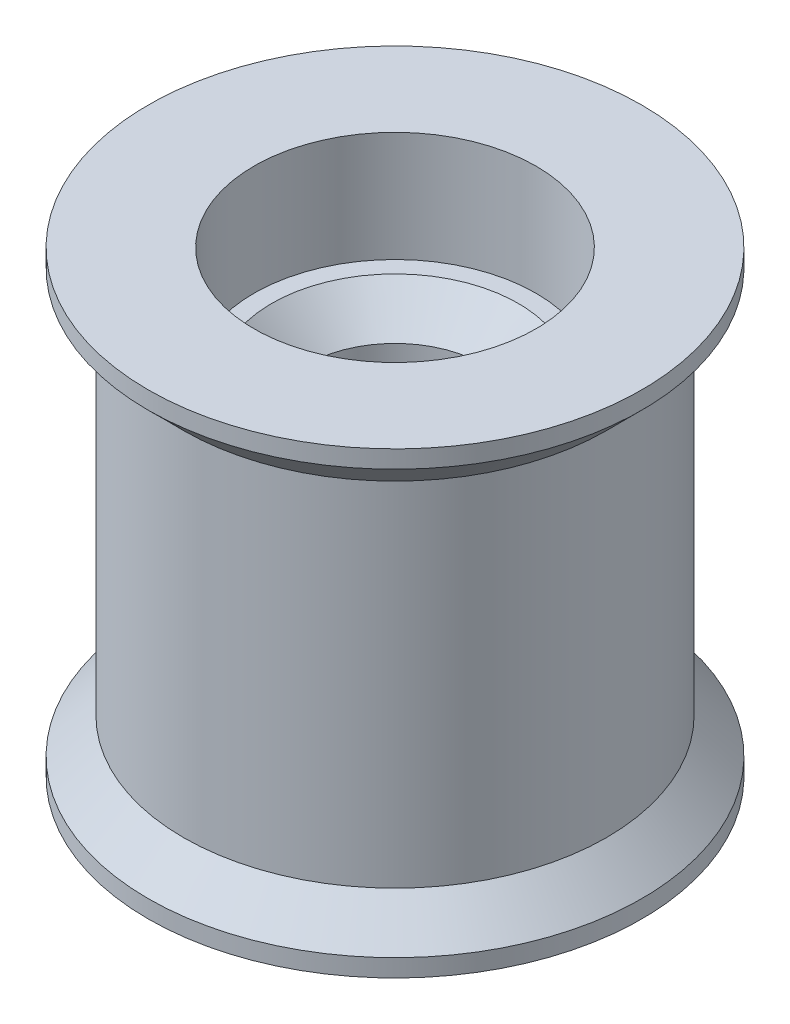
ISO-10303-21;
HEADER;
FILE_DESCRIPTION(('STEP AP214'),'2;1');
FILE_NAME('part.step','',(''),(''),'','','');
FILE_SCHEMA(('AUTOMOTIVE_DESIGN { 1 0 10303 214 1 1 1 1 }'));
ENDSEC;
DATA;
#1=APPLICATION_CONTEXT('core data for automotive mechanical design processes');
#2=APPLICATION_PROTOCOL_DEFINITION('international standard','automotive_design',2000,#1);
#3=PRODUCT_CONTEXT('',#1,'mechanical');
#4=PRODUCT('Part','Part','',(#3));
#5=PRODUCT_RELATED_PRODUCT_CATEGORY('part','',(#4));
#6=PRODUCT_DEFINITION_FORMATION('','',#4);
#7=PRODUCT_DEFINITION_CONTEXT('part definition',#1,'design');
#8=PRODUCT_DEFINITION('design','',#6,#7);
#9=PRODUCT_DEFINITION_SHAPE('','',#8);
#10=(LENGTH_UNIT() NAMED_UNIT(*) SI_UNIT(.MILLI.,.METRE.));
#11=(NAMED_UNIT(*) PLANE_ANGLE_UNIT() SI_UNIT($,.RADIAN.));
#12=(NAMED_UNIT(*) SI_UNIT($,.STERADIAN.) SOLID_ANGLE_UNIT());
#13=UNCERTAINTY_MEASURE_WITH_UNIT(LENGTH_MEASURE(1.E-05),#10,'distance_accuracy_value','');
#14=(GEOMETRIC_REPRESENTATION_CONTEXT(3) GLOBAL_UNCERTAINTY_ASSIGNED_CONTEXT((#13)) GLOBAL_UNIT_ASSIGNED_CONTEXT((#10,
#11,#12)) REPRESENTATION_CONTEXT('',''));
#15=CARTESIAN_POINT('',(0.,0.,0.));
#16=DIRECTION('',(0.,0.,1.));
#17=DIRECTION('',(1.,0.,0.));
#18=AXIS2_PLACEMENT_3D('',#15,#16,#17);
#19=CARTESIAN_POINT('',(0.,0.,0.));
#20=DIRECTION('',(0.,-1.,0.));
#21=DIRECTION('',(0.,0.,-1.));
#22=AXIS2_PLACEMENT_3D('',#19,#20,#21);
#23=CYLINDRICAL_SURFACE('',#22,2.50000000000051);
#24=CARTESIAN_POINT('',(0.,-2.37500000000052,0.));
#25=DIRECTION('',(0.,-1.,0.));
#26=DIRECTION('',(0.,0.,-1.));
#27=AXIS2_PLACEMENT_3D('',#24,#25,#26);
#28=CIRCLE('',#27,2.50000000000051);
#29=CARTESIAN_POINT('',(0.,-2.37500000000052,-2.50000000000051));
#30=VERTEX_POINT('',#29);
#31=EDGE_CURVE('E53',#30,#30,#28,.T.);
#32=ORIENTED_EDGE('',*,*,#31,.T.);
#33=EDGE_LOOP('',(#32));
#34=FACE_BOUND('',#33,.T.);
#35=CARTESIAN_POINT('',(0.,2.37500000000051,0.));
#36=DIRECTION('',(0.,1.,0.));
#37=DIRECTION('',(0.,0.,1.));
#38=AXIS2_PLACEMENT_3D('',#35,#36,#37);
#39=CIRCLE('',#38,2.50000000000051);
#40=CARTESIAN_POINT('',(0.,2.37500000000051,2.50000000000051));
#41=VERTEX_POINT('',#40);
#42=EDGE_CURVE('E57',#41,#41,#39,.T.);
#43=ORIENTED_EDGE('',*,*,#42,.T.);
#44=EDGE_LOOP('',(#43));
#45=FACE_BOUND('',#44,.T.);
#46=ADVANCED_FACE('F41',(#34,#45),#23,.F.);
#47=CARTESIAN_POINT('',(0.,3.375,-2.5));
#48=DIRECTION('',(0.,1.,0.));
#49=DIRECTION('',(0.,0.,1.));
#50=AXIS2_PLACEMENT_3D('',#47,#48,#49);
#51=PLANE('',#50);
#52=CARTESIAN_POINT('',(0.,3.375,0.));
#53=DIRECTION('',(0.,1.,0.));
#54=DIRECTION('',(0.,0.,1.));
#55=AXIS2_PLACEMENT_3D('',#52,#53,#54);
#56=CIRCLE('',#55,3.5);
#57=CARTESIAN_POINT('',(0.,3.375,3.5));
#58=VERTEX_POINT('',#57);
#59=EDGE_CURVE('E10',#58,#58,#56,.F.);
#60=ORIENTED_EDGE('',*,*,#59,.T.);
#61=EDGE_LOOP('',(#60));
#62=FACE_BOUND('',#61,.T.);
#63=CARTESIAN_POINT('',(0.,3.375,0.));
#64=DIRECTION('',(0.,-1.,0.));
#65=DIRECTION('',(0.,0.,-1.));
#66=AXIS2_PLACEMENT_3D('',#63,#64,#65);
#67=CIRCLE('',#66,4.);
#68=CARTESIAN_POINT('',(0.,3.375,-4.));
#69=VERTEX_POINT('',#68);
#70=EDGE_CURVE('E62',#69,#69,#67,.T.);
#71=ORIENTED_EDGE('',*,*,#70,.F.);
#72=EDGE_LOOP('',(#71));
#73=FACE_BOUND('',#72,.T.);
#74=ADVANCED_FACE('F111',(#62,#73),#51,.T.);
#75=CARTESIAN_POINT('',(0.,0.,0.));
#76=DIRECTION('',(0.,-1.,0.));
#77=DIRECTION('',(0.,0.,-1.));
#78=AXIS2_PLACEMENT_3D('',#75,#76,#77);
#79=CYLINDRICAL_SURFACE('',#78,4.);
#80=ORIENTED_EDGE('',*,*,#70,.T.);
#81=EDGE_LOOP('',(#80));
#82=FACE_BOUND('',#81,.T.);
#83=CARTESIAN_POINT('',(0.,6.5,0.));
#84=DIRECTION('',(0.,-1.,0.));
#85=DIRECTION('',(0.,0.,-1.));
#86=AXIS2_PLACEMENT_3D('',#83,#84,#85);
#87=CIRCLE('',#86,4.);
#88=CARTESIAN_POINT('',(0.,6.5,-4.));
#89=VERTEX_POINT('',#88);
#90=EDGE_CURVE('E65',#89,#89,#87,.T.);
#91=ORIENTED_EDGE('',*,*,#90,.F.);
#92=EDGE_LOOP('',(#91));
#93=FACE_BOUND('',#92,.T.);
#94=ADVANCED_FACE('F117',(#82,#93),#79,.F.);
#95=CARTESIAN_POINT('',(0.,6.5,-4.));
#96=DIRECTION('',(0.,1.,0.));
#97=DIRECTION('',(0.,0.,1.));
#98=AXIS2_PLACEMENT_3D('',#95,#96,#97);
#99=PLANE('',#98);
#100=ORIENTED_EDGE('',*,*,#90,.T.);
#101=EDGE_LOOP('',(#100));
#102=FACE_BOUND('',#101,.T.);
#103=CARTESIAN_POINT('',(0.,6.5,0.));
#104=DIRECTION('',(0.,-1.,0.));
#105=DIRECTION('',(0.,0.,-1.));
#106=AXIS2_PLACEMENT_3D('',#103,#104,#105);
#107=CIRCLE('',#106,7.);
#108=CARTESIAN_POINT('',(0.,6.5,-7.));
#109=VERTEX_POINT('',#108);
#110=EDGE_CURVE('E68',#109,#109,#107,.T.);
#111=ORIENTED_EDGE('',*,*,#110,.F.);
#112=EDGE_LOOP('',(#111));
#113=FACE_BOUND('',#112,.T.);
#114=ADVANCED_FACE('F240',(#102,#113),#99,.T.);
#115=CARTESIAN_POINT('',(0.,0.,0.));
#116=DIRECTION('',(0.,-1.,0.));
#117=DIRECTION('',(0.,0.,-1.));
#118=AXIS2_PLACEMENT_3D('',#115,#116,#117);
#119=CYLINDRICAL_SURFACE('',#118,7.);
#120=ORIENTED_EDGE('',*,*,#110,.T.);
#121=EDGE_LOOP('',(#120));
#122=FACE_BOUND('',#121,.T.);
#123=CARTESIAN_POINT('',(0.,6.,0.));
#124=DIRECTION('',(0.,-1.,0.));
#125=DIRECTION('',(0.,0.,-1.));
#126=AXIS2_PLACEMENT_3D('',#123,#124,#125);
#127=CIRCLE('',#126,7.);
#128=CARTESIAN_POINT('',(0.,6.,-7.));
#129=VERTEX_POINT('',#128);
#130=EDGE_CURVE('E71',#129,#129,#127,.T.);
#131=ORIENTED_EDGE('',*,*,#130,.F.);
#132=EDGE_LOOP('',(#131));
#133=FACE_BOUND('',#132,.T.);
#134=ADVANCED_FACE('F107',(#122,#133),#119,.T.);
#135=CARTESIAN_POINT('',(0.,5.,0.));
#136=DIRECTION('',(0.,1.,0.));
#137=DIRECTION('',(0.,0.,1.));
#138=AXIS2_PLACEMENT_3D('',#135,#136,#137);
#139=CONICAL_SURFACE('',#138,6.,0.785398163397448);
#140=ORIENTED_EDGE('',*,*,#130,.T.);
#141=EDGE_LOOP('',(#140));
#142=FACE_BOUND('',#141,.T.);
#143=CARTESIAN_POINT('',(0.,5.,0.));
#144=DIRECTION('',(0.,-1.,0.));
#145=DIRECTION('',(0.,0.,-1.));
#146=AXIS2_PLACEMENT_3D('',#143,#144,#145);
#147=CIRCLE('',#146,6.);
#148=CARTESIAN_POINT('',(0.,5.,-6.));
#149=VERTEX_POINT('',#148);
#150=EDGE_CURVE('E74',#149,#149,#147,.T.);
#151=ORIENTED_EDGE('',*,*,#150,.F.);
#152=EDGE_LOOP('',(#151));
#153=FACE_BOUND('',#152,.T.);
#154=ADVANCED_FACE('F98',(#142,#153),#139,.T.);
#155=CARTESIAN_POINT('',(0.,0.,0.));
#156=DIRECTION('',(0.,-1.,0.));
#157=DIRECTION('',(0.,0.,-1.));
#158=AXIS2_PLACEMENT_3D('',#155,#156,#157);
#159=CYLINDRICAL_SURFACE('',#158,6.);
#160=ORIENTED_EDGE('',*,*,#150,.T.);
#161=EDGE_LOOP('',(#160));
#162=FACE_BOUND('',#161,.T.);
#163=CARTESIAN_POINT('',(0.,-5.,0.));
#164=DIRECTION('',(0.,-1.,0.));
#165=DIRECTION('',(0.,0.,-1.));
#166=AXIS2_PLACEMENT_3D('',#163,#164,#165);
#167=CIRCLE('',#166,6.);
#168=CARTESIAN_POINT('',(0.,-5.,-6.));
#169=VERTEX_POINT('',#168);
#170=EDGE_CURVE('E89',#169,#169,#167,.T.);
#171=ORIENTED_EDGE('',*,*,#170,.F.);
#172=EDGE_LOOP('',(#171));
#173=FACE_BOUND('',#172,.T.);
#174=ADVANCED_FACE('F95',(#162,#173),#159,.T.);
#175=CARTESIAN_POINT('',(0.,-3.375,-2.5));
#176=DIRECTION('',(0.,-1.,0.));
#177=DIRECTION('',(0.,0.,1.));
#178=AXIS2_PLACEMENT_3D('',#175,#176,#177);
#179=PLANE('',#178);
#180=CARTESIAN_POINT('',(0.,-3.375,0.));
#181=DIRECTION('',(0.,-1.,0.));
#182=DIRECTION('',(0.,0.,-1.));
#183=AXIS2_PLACEMENT_3D('',#180,#181,#182);
#184=CIRCLE('',#183,3.5);
#185=CARTESIAN_POINT('',(0.,-3.375,-3.5));
#186=VERTEX_POINT('',#185);
#187=EDGE_CURVE('E49',#186,#186,#184,.F.);
#188=ORIENTED_EDGE('',*,*,#187,.T.);
#189=EDGE_LOOP('',(#188));
#190=FACE_BOUND('',#189,.T.);
#191=CARTESIAN_POINT('',(0.,-3.375,0.));
#192=DIRECTION('',(0.,-1.,0.));
#193=DIRECTION('',(0.,0.,-1.));
#194=AXIS2_PLACEMENT_3D('',#191,#192,#193);
#195=CIRCLE('',#194,4.);
#196=CARTESIAN_POINT('',(0.,-3.375,-4.));
#197=VERTEX_POINT('',#196);
#198=EDGE_CURVE('E77',#197,#197,#195,.T.);
#199=ORIENTED_EDGE('',*,*,#198,.T.);
#200=EDGE_LOOP('',(#199));
#201=FACE_BOUND('',#200,.T.);
#202=ADVANCED_FACE('F97',(#190,#201),#179,.T.);
#203=CARTESIAN_POINT('',(0.,0.,0.));
#204=DIRECTION('',(0.,1.,0.));
#205=DIRECTION('',(0.,0.,-1.));
#206=AXIS2_PLACEMENT_3D('',#203,#204,#205);
#207=CYLINDRICAL_SURFACE('',#206,4.);
#208=ORIENTED_EDGE('',*,*,#198,.F.);
#209=EDGE_LOOP('',(#208));
#210=FACE_BOUND('',#209,.T.);
#211=CARTESIAN_POINT('',(0.,-6.5,0.));
#212=DIRECTION('',(0.,-1.,0.));
#213=DIRECTION('',(0.,0.,-1.));
#214=AXIS2_PLACEMENT_3D('',#211,#212,#213);
#215=CIRCLE('',#214,4.);
#216=CARTESIAN_POINT('',(0.,-6.5,-4.));
#217=VERTEX_POINT('',#216);
#218=EDGE_CURVE('E80',#217,#217,#215,.T.);
#219=ORIENTED_EDGE('',*,*,#218,.T.);
#220=EDGE_LOOP('',(#219));
#221=FACE_BOUND('',#220,.T.);
#222=ADVANCED_FACE('F105',(#210,#221),#207,.F.);
#223=CARTESIAN_POINT('',(0.,-6.5,-4.));
#224=DIRECTION('',(0.,-1.,0.));
#225=DIRECTION('',(0.,0.,1.));
#226=AXIS2_PLACEMENT_3D('',#223,#224,#225);
#227=PLANE('',#226);
#228=ORIENTED_EDGE('',*,*,#218,.F.);
#229=EDGE_LOOP('',(#228));
#230=FACE_BOUND('',#229,.T.);
#231=CARTESIAN_POINT('',(0.,-6.5,0.));
#232=DIRECTION('',(0.,-1.,0.));
#233=DIRECTION('',(0.,0.,-1.));
#234=AXIS2_PLACEMENT_3D('',#231,#232,#233);
#235=CIRCLE('',#234,7.);
#236=CARTESIAN_POINT('',(0.,-6.5,-7.));
#237=VERTEX_POINT('',#236);
#238=EDGE_CURVE('E83',#237,#237,#235,.T.);
#239=ORIENTED_EDGE('',*,*,#238,.T.);
#240=EDGE_LOOP('',(#239));
#241=FACE_BOUND('',#240,.T.);
#242=ADVANCED_FACE('F140',(#230,#241),#227,.T.);
#243=CARTESIAN_POINT('',(0.,0.,0.));
#244=DIRECTION('',(0.,1.,0.));
#245=DIRECTION('',(0.,0.,-1.));
#246=AXIS2_PLACEMENT_3D('',#243,#244,#245);
#247=CYLINDRICAL_SURFACE('',#246,7.);
#248=ORIENTED_EDGE('',*,*,#238,.F.);
#249=EDGE_LOOP('',(#248));
#250=FACE_BOUND('',#249,.T.);
#251=CARTESIAN_POINT('',(0.,-6.,0.));
#252=DIRECTION('',(0.,-1.,0.));
#253=DIRECTION('',(0.,0.,-1.));
#254=AXIS2_PLACEMENT_3D('',#251,#252,#253);
#255=CIRCLE('',#254,7.);
#256=CARTESIAN_POINT('',(0.,-6.,-7.));
#257=VERTEX_POINT('',#256);
#258=EDGE_CURVE('E86',#257,#257,#255,.T.);
#259=ORIENTED_EDGE('',*,*,#258,.T.);
#260=EDGE_LOOP('',(#259));
#261=FACE_BOUND('',#260,.T.);
#262=ADVANCED_FACE('F132',(#250,#261),#247,.T.);
#263=CARTESIAN_POINT('',(0.,-5.,0.));
#264=DIRECTION('',(0.,-1.,0.));
#265=DIRECTION('',(0.,0.,1.));
#266=AXIS2_PLACEMENT_3D('',#263,#264,#265);
#267=CONICAL_SURFACE('',#266,6.,0.785398163397448);
#268=ORIENTED_EDGE('',*,*,#258,.F.);
#269=EDGE_LOOP('',(#268));
#270=FACE_BOUND('',#269,.T.);
#271=ORIENTED_EDGE('',*,*,#170,.T.);
#272=EDGE_LOOP('',(#271));
#273=FACE_BOUND('',#272,.T.);
#274=ADVANCED_FACE('F93',(#270,#273),#267,.T.);
#275=CARTESIAN_POINT('',(0.,-2.37500000000052,0.));
#276=DIRECTION('',(0.,-1.,0.));
#277=DIRECTION('',(0.,0.,-1.));
#278=AXIS2_PLACEMENT_3D('',#275,#276,#277);
#279=CONICAL_SURFACE('',#278,2.50000000000051,0.785398163397449);
#280=ORIENTED_EDGE('',*,*,#187,.F.);
#281=EDGE_LOOP('',(#280));
#282=FACE_BOUND('',#281,.T.);
#283=ORIENTED_EDGE('',*,*,#31,.F.);
#284=EDGE_LOOP('',(#283));
#285=FACE_BOUND('',#284,.T.);
#286=ADVANCED_FACE('F122',(#282,#285),#279,.F.);
#287=CARTESIAN_POINT('',(0.,3.375,0.));
#288=DIRECTION('',(0.,1.,0.));
#289=DIRECTION('',(0.,0.,1.));
#290=AXIS2_PLACEMENT_3D('',#287,#288,#289);
#291=CONICAL_SURFACE('',#290,3.5,0.785398163397446);
#292=ORIENTED_EDGE('',*,*,#42,.F.);
#293=EDGE_LOOP('',(#292));
#294=FACE_BOUND('',#293,.T.);
#295=ORIENTED_EDGE('',*,*,#59,.F.);
#296=EDGE_LOOP('',(#295));
#297=FACE_BOUND('',#296,.T.);
#298=ADVANCED_FACE('F44',(#294,#297),#291,.F.);
#299=CLOSED_SHELL('',(#46,#74,#94,#114,#134,#154,#174,#202,#222,#242,#262,#274,#286,#298));
#300=MANIFOLD_SOLID_BREP('B2',#299);
#301=ADVANCED_BREP_SHAPE_REPRESENTATION('',(#18,#300),#14);
#302=SHAPE_DEFINITION_REPRESENTATION(#9,#301);
ENDSEC;
END-ISO-10303-21;
